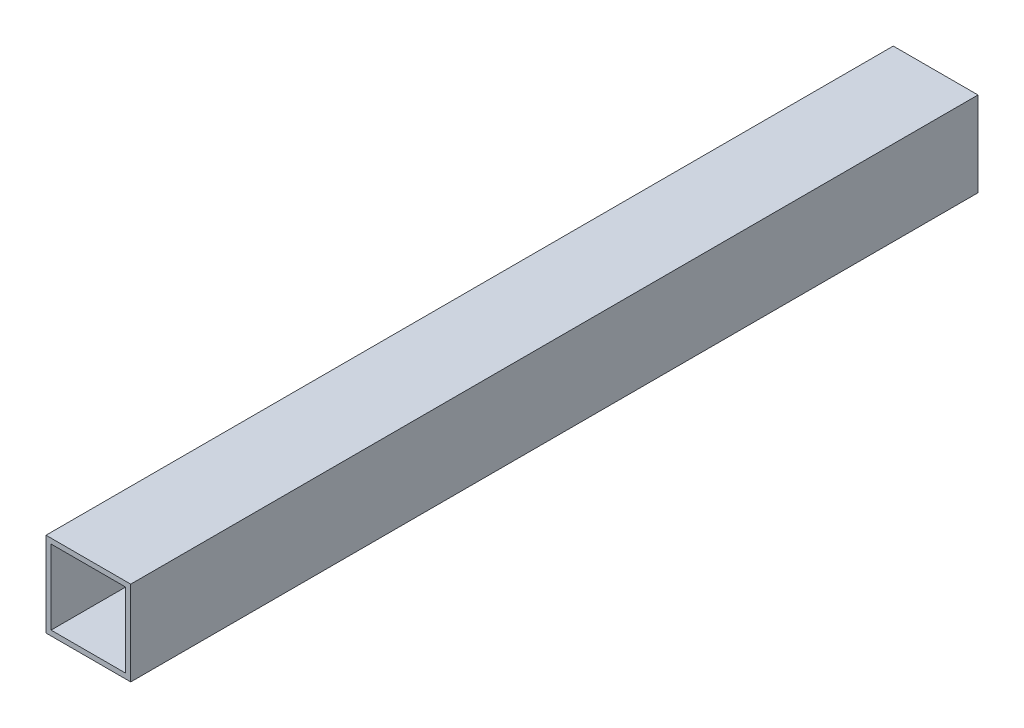
ISO-10303-21;
HEADER;
FILE_DESCRIPTION(('STEP AP214'),'2;1');
FILE_NAME('part.step','',(''),(''),'','','');
FILE_SCHEMA(('AUTOMOTIVE_DESIGN { 1 0 10303 214 1 1 1 1 }'));
ENDSEC;
DATA;
#1=APPLICATION_CONTEXT('core data for automotive mechanical design processes');
#2=APPLICATION_PROTOCOL_DEFINITION('international standard','automotive_design',2000,#1);
#3=PRODUCT_CONTEXT('',#1,'mechanical');
#4=PRODUCT('Part','Part','',(#3));
#5=PRODUCT_RELATED_PRODUCT_CATEGORY('part','',(#4));
#6=PRODUCT_DEFINITION_FORMATION('','',#4);
#7=PRODUCT_DEFINITION_CONTEXT('part definition',#1,'design');
#8=PRODUCT_DEFINITION('design','',#6,#7);
#9=PRODUCT_DEFINITION_SHAPE('','',#8);
#10=(LENGTH_UNIT() NAMED_UNIT(*) SI_UNIT(.MILLI.,.METRE.));
#11=(NAMED_UNIT(*) PLANE_ANGLE_UNIT() SI_UNIT($,.RADIAN.));
#12=(NAMED_UNIT(*) SI_UNIT($,.STERADIAN.) SOLID_ANGLE_UNIT());
#13=UNCERTAINTY_MEASURE_WITH_UNIT(LENGTH_MEASURE(1.E-05),#10,'distance_accuracy_value','');
#14=(GEOMETRIC_REPRESENTATION_CONTEXT(3) GLOBAL_UNCERTAINTY_ASSIGNED_CONTEXT((#13)) GLOBAL_UNIT_ASSIGNED_CONTEXT((#10,
#11,#12)) REPRESENTATION_CONTEXT('',''));
#15=CARTESIAN_POINT('',(0.,0.,0.));
#16=DIRECTION('',(0.,0.,1.));
#17=DIRECTION('',(1.,0.,0.));
#18=AXIS2_PLACEMENT_3D('',#15,#16,#17);
#19=CARTESIAN_POINT('',(0.,0.,250.));
#20=DIRECTION('',(0.,0.,1.));
#21=DIRECTION('',(1.,0.,0.));
#22=AXIS2_PLACEMENT_3D('',#19,#20,#21);
#23=PLANE('',#22);
#24=DIRECTION('',(0.,1.,0.));
#25=VECTOR('',#24,1.);
#26=CARTESIAN_POINT('',(12.5,-12.5,250.));
#27=LINE('',#26,#25);
#28=CARTESIAN_POINT('',(12.5,-12.5,250.));
#29=VERTEX_POINT('',#28);
#30=CARTESIAN_POINT('',(12.5,12.5,250.));
#31=VERTEX_POINT('',#30);
#32=EDGE_CURVE('E157',#29,#31,#27,.T.);
#33=ORIENTED_EDGE('',*,*,#32,.T.);
#34=DIRECTION('',(-1.,0.,0.));
#35=VECTOR('',#34,1.);
#36=CARTESIAN_POINT('',(-12.5,12.5,250.));
#37=LINE('',#36,#35);
#38=CARTESIAN_POINT('',(-12.5,12.5,250.));
#39=VERTEX_POINT('',#38);
#40=EDGE_CURVE('E160',#31,#39,#37,.T.);
#41=ORIENTED_EDGE('',*,*,#40,.T.);
#42=DIRECTION('',(0.,-1.,0.));
#43=VECTOR('',#42,1.);
#44=CARTESIAN_POINT('',(-12.5,-12.5,250.));
#45=LINE('',#44,#43);
#46=CARTESIAN_POINT('',(-12.5,-12.5,250.));
#47=VERTEX_POINT('',#46);
#48=EDGE_CURVE('E163',#39,#47,#45,.T.);
#49=ORIENTED_EDGE('',*,*,#48,.T.);
#50=DIRECTION('',(1.,0.,0.));
#51=VECTOR('',#50,1.);
#52=CARTESIAN_POINT('',(-12.5,-12.5,250.));
#53=LINE('',#52,#51);
#54=EDGE_CURVE('E165',#47,#29,#53,.T.);
#55=ORIENTED_EDGE('',*,*,#54,.T.);
#56=EDGE_LOOP('',(#33,#41,#49,#55));
#57=FACE_BOUND('',#56,.T.);
#58=DIRECTION('',(-1.,0.,0.));
#59=VECTOR('',#58,1.);
#60=CARTESIAN_POINT('',(0.,11.,250.));
#61=LINE('',#60,#59);
#62=CARTESIAN_POINT('',(11.,11.,250.));
#63=VERTEX_POINT('',#62);
#64=CARTESIAN_POINT('',(-11.,11.,250.));
#65=VERTEX_POINT('',#64);
#66=EDGE_CURVE('E129',#63,#65,#61,.T.);
#67=ORIENTED_EDGE('',*,*,#66,.F.);
#68=DIRECTION('',(0.,1.,0.));
#69=VECTOR('',#68,1.);
#70=CARTESIAN_POINT('',(11.,0.,250.));
#71=LINE('',#70,#69);
#72=CARTESIAN_POINT('',(11.,-11.,250.));
#73=VERTEX_POINT('',#72);
#74=EDGE_CURVE('E121',#73,#63,#71,.T.);
#75=ORIENTED_EDGE('',*,*,#74,.F.);
#76=DIRECTION('',(1.,0.,0.));
#77=VECTOR('',#76,1.);
#78=CARTESIAN_POINT('',(0.,-11.,250.));
#79=LINE('',#78,#77);
#80=CARTESIAN_POINT('',(-11.,-11.,250.));
#81=VERTEX_POINT('',#80);
#82=EDGE_CURVE('E143',#81,#73,#79,.T.);
#83=ORIENTED_EDGE('',*,*,#82,.F.);
#84=DIRECTION('',(0.,-1.,0.));
#85=VECTOR('',#84,1.);
#86=CARTESIAN_POINT('',(-11.,0.,250.));
#87=LINE('',#86,#85);
#88=EDGE_CURVE('E141',#65,#81,#87,.T.);
#89=ORIENTED_EDGE('',*,*,#88,.F.);
#90=EDGE_LOOP('',(#67,#75,#83,#89));
#91=FACE_BOUND('',#90,.T.);
#92=ADVANCED_FACE('F56',(#57,#91),#23,.T.);
#93=CARTESIAN_POINT('',(0.,0.,0.));
#94=DIRECTION('',(0.,0.,1.));
#95=DIRECTION('',(1.,0.,0.));
#96=AXIS2_PLACEMENT_3D('',#93,#94,#95);
#97=PLANE('',#96);
#98=DIRECTION('',(0.,1.,0.));
#99=VECTOR('',#98,1.);
#100=CARTESIAN_POINT('',(12.5,-12.5,0.));
#101=LINE('',#100,#99);
#102=CARTESIAN_POINT('',(12.5,-12.5,0.));
#103=VERTEX_POINT('',#102);
#104=CARTESIAN_POINT('',(12.5,12.5,0.));
#105=VERTEX_POINT('',#104);
#106=EDGE_CURVE('E137',#103,#105,#101,.T.);
#107=ORIENTED_EDGE('',*,*,#106,.F.);
#108=DIRECTION('',(1.,0.,0.));
#109=VECTOR('',#108,1.);
#110=CARTESIAN_POINT('',(-12.5,-12.5,0.));
#111=LINE('',#110,#109);
#112=CARTESIAN_POINT('',(-12.5,-12.5,0.));
#113=VERTEX_POINT('',#112);
#114=EDGE_CURVE('E161',#113,#103,#111,.T.);
#115=ORIENTED_EDGE('',*,*,#114,.F.);
#116=DIRECTION('',(0.,-1.,0.));
#117=VECTOR('',#116,1.);
#118=CARTESIAN_POINT('',(-12.5,-12.5,0.));
#119=LINE('',#118,#117);
#120=CARTESIAN_POINT('',(-12.5,12.5,0.));
#121=VERTEX_POINT('',#120);
#122=EDGE_CURVE('E172',#121,#113,#119,.T.);
#123=ORIENTED_EDGE('',*,*,#122,.F.);
#124=DIRECTION('',(-1.,0.,0.));
#125=VECTOR('',#124,1.);
#126=CARTESIAN_POINT('',(-12.5,12.5,0.));
#127=LINE('',#126,#125);
#128=EDGE_CURVE('E170',#105,#121,#127,.T.);
#129=ORIENTED_EDGE('',*,*,#128,.F.);
#130=EDGE_LOOP('',(#107,#115,#123,#129));
#131=FACE_BOUND('',#130,.T.);
#132=DIRECTION('',(0.,1.,0.));
#133=VECTOR('',#132,1.);
#134=CARTESIAN_POINT('',(11.,0.,0.));
#135=LINE('',#134,#133);
#136=CARTESIAN_POINT('',(11.,-11.,0.));
#137=VERTEX_POINT('',#136);
#138=CARTESIAN_POINT('',(11.,11.,0.));
#139=VERTEX_POINT('',#138);
#140=EDGE_CURVE('E79',#137,#139,#135,.T.);
#141=ORIENTED_EDGE('',*,*,#140,.T.);
#142=DIRECTION('',(-1.,0.,0.));
#143=VECTOR('',#142,1.);
#144=CARTESIAN_POINT('',(0.,11.,0.));
#145=LINE('',#144,#143);
#146=CARTESIAN_POINT('',(-11.,11.,0.));
#147=VERTEX_POINT('',#146);
#148=EDGE_CURVE('E136',#139,#147,#145,.T.);
#149=ORIENTED_EDGE('',*,*,#148,.T.);
#150=DIRECTION('',(0.,-1.,0.));
#151=VECTOR('',#150,1.);
#152=CARTESIAN_POINT('',(-11.,0.,0.));
#153=LINE('',#152,#151);
#154=CARTESIAN_POINT('',(-11.,-11.,0.));
#155=VERTEX_POINT('',#154);
#156=EDGE_CURVE('E149',#147,#155,#153,.T.);
#157=ORIENTED_EDGE('',*,*,#156,.T.);
#158=DIRECTION('',(1.,0.,0.));
#159=VECTOR('',#158,1.);
#160=CARTESIAN_POINT('',(0.,-11.,0.));
#161=LINE('',#160,#159);
#162=EDGE_CURVE('E130',#155,#137,#161,.T.);
#163=ORIENTED_EDGE('',*,*,#162,.T.);
#164=EDGE_LOOP('',(#141,#149,#157,#163));
#165=FACE_BOUND('',#164,.T.);
#166=ADVANCED_FACE('F190',(#131,#165),#97,.F.);
#167=CARTESIAN_POINT('',(12.5,-12.5,250.));
#168=DIRECTION('',(-1.,0.,0.));
#169=DIRECTION('',(0.,0.,1.));
#170=AXIS2_PLACEMENT_3D('',#167,#168,#169);
#171=PLANE('',#170);
#172=ORIENTED_EDGE('',*,*,#106,.T.);
#173=DIRECTION('',(0.,0.,-1.));
#174=VECTOR('',#173,1.);
#175=CARTESIAN_POINT('',(12.5,12.5,250.));
#176=LINE('',#175,#174);
#177=EDGE_CURVE('E12',#31,#105,#176,.T.);
#178=ORIENTED_EDGE('',*,*,#177,.F.);
#179=ORIENTED_EDGE('',*,*,#32,.F.);
#180=DIRECTION('',(0.,0.,-1.));
#181=VECTOR('',#180,1.);
#182=CARTESIAN_POINT('',(12.5,-12.5,250.));
#183=LINE('',#182,#181);
#184=EDGE_CURVE('E167',#29,#103,#183,.T.);
#185=ORIENTED_EDGE('',*,*,#184,.T.);
#186=EDGE_LOOP('',(#172,#178,#179,#185));
#187=FACE_BOUND('',#186,.T.);
#188=ADVANCED_FACE('F58',(#187),#171,.F.);
#189=CARTESIAN_POINT('',(-12.5,12.5,250.));
#190=DIRECTION('',(0.,-1.,0.));
#191=DIRECTION('',(0.,0.,-1.));
#192=AXIS2_PLACEMENT_3D('',#189,#190,#191);
#193=PLANE('',#192);
#194=ORIENTED_EDGE('',*,*,#128,.T.);
#195=DIRECTION('',(0.,0.,-1.));
#196=VECTOR('',#195,1.);
#197=CARTESIAN_POINT('',(-12.5,12.5,250.));
#198=LINE('',#197,#196);
#199=EDGE_CURVE('E64',#39,#121,#198,.T.);
#200=ORIENTED_EDGE('',*,*,#199,.F.);
#201=ORIENTED_EDGE('',*,*,#40,.F.);
#202=ORIENTED_EDGE('',*,*,#177,.T.);
#203=EDGE_LOOP('',(#194,#200,#201,#202));
#204=FACE_BOUND('',#203,.T.);
#205=ADVANCED_FACE('F200',(#204),#193,.F.);
#206=CARTESIAN_POINT('',(-12.5,-12.5,250.));
#207=DIRECTION('',(1.,0.,0.));
#208=DIRECTION('',(0.,0.,-1.));
#209=AXIS2_PLACEMENT_3D('',#206,#207,#208);
#210=PLANE('',#209);
#211=ORIENTED_EDGE('',*,*,#122,.T.);
#212=DIRECTION('',(0.,0.,-1.));
#213=VECTOR('',#212,1.);
#214=CARTESIAN_POINT('',(-12.5,-12.5,250.));
#215=LINE('',#214,#213);
#216=EDGE_CURVE('E177',#47,#113,#215,.T.);
#217=ORIENTED_EDGE('',*,*,#216,.F.);
#218=ORIENTED_EDGE('',*,*,#48,.F.);
#219=ORIENTED_EDGE('',*,*,#199,.T.);
#220=EDGE_LOOP('',(#211,#217,#218,#219));
#221=FACE_BOUND('',#220,.T.);
#222=ADVANCED_FACE('F184',(#221),#210,.F.);
#223=CARTESIAN_POINT('',(-12.5,-12.5,250.));
#224=DIRECTION('',(0.,1.,0.));
#225=DIRECTION('',(0.,0.,1.));
#226=AXIS2_PLACEMENT_3D('',#223,#224,#225);
#227=PLANE('',#226);
#228=ORIENTED_EDGE('',*,*,#114,.T.);
#229=ORIENTED_EDGE('',*,*,#184,.F.);
#230=ORIENTED_EDGE('',*,*,#54,.F.);
#231=ORIENTED_EDGE('',*,*,#216,.T.);
#232=EDGE_LOOP('',(#228,#229,#230,#231));
#233=FACE_BOUND('',#232,.T.);
#234=ADVANCED_FACE('F194',(#233),#227,.F.);
#235=CARTESIAN_POINT('',(11.,0.,250.));
#236=DIRECTION('',(-1.,0.,0.));
#237=DIRECTION('',(0.,0.,1.));
#238=AXIS2_PLACEMENT_3D('',#235,#236,#237);
#239=PLANE('',#238);
#240=ORIENTED_EDGE('',*,*,#140,.F.);
#241=DIRECTION('',(0.,0.,-1.));
#242=VECTOR('',#241,1.);
#243=CARTESIAN_POINT('',(11.,-11.,250.));
#244=LINE('',#243,#242);
#245=EDGE_CURVE('E125',#73,#137,#244,.T.);
#246=ORIENTED_EDGE('',*,*,#245,.F.);
#247=ORIENTED_EDGE('',*,*,#74,.T.);
#248=DIRECTION('',(0.,0.,-1.));
#249=VECTOR('',#248,1.);
#250=CARTESIAN_POINT('',(11.,11.,250.));
#251=LINE('',#250,#249);
#252=EDGE_CURVE('E124',#63,#139,#251,.T.);
#253=ORIENTED_EDGE('',*,*,#252,.T.);
#254=EDGE_LOOP('',(#240,#246,#247,#253));
#255=FACE_BOUND('',#254,.T.);
#256=ADVANCED_FACE('F123',(#255),#239,.T.);
#257=CARTESIAN_POINT('',(0.,11.,250.));
#258=DIRECTION('',(0.,-1.,0.));
#259=DIRECTION('',(0.,0.,-1.));
#260=AXIS2_PLACEMENT_3D('',#257,#258,#259);
#261=PLANE('',#260);
#262=ORIENTED_EDGE('',*,*,#148,.F.);
#263=ORIENTED_EDGE('',*,*,#252,.F.);
#264=ORIENTED_EDGE('',*,*,#66,.T.);
#265=DIRECTION('',(0.,0.,-1.));
#266=VECTOR('',#265,1.);
#267=CARTESIAN_POINT('',(-11.,11.,250.));
#268=LINE('',#267,#266);
#269=EDGE_CURVE('E138',#65,#147,#268,.T.);
#270=ORIENTED_EDGE('',*,*,#269,.T.);
#271=EDGE_LOOP('',(#262,#263,#264,#270));
#272=FACE_BOUND('',#271,.T.);
#273=ADVANCED_FACE('F133',(#272),#261,.T.);
#274=CARTESIAN_POINT('',(-11.,0.,250.));
#275=DIRECTION('',(1.,0.,0.));
#276=DIRECTION('',(0.,0.,-1.));
#277=AXIS2_PLACEMENT_3D('',#274,#275,#276);
#278=PLANE('',#277);
#279=ORIENTED_EDGE('',*,*,#156,.F.);
#280=ORIENTED_EDGE('',*,*,#269,.F.);
#281=ORIENTED_EDGE('',*,*,#88,.T.);
#282=DIRECTION('',(0.,0.,-1.));
#283=VECTOR('',#282,1.);
#284=CARTESIAN_POINT('',(-11.,-11.,250.));
#285=LINE('',#284,#283);
#286=EDGE_CURVE('E71',#81,#155,#285,.T.);
#287=ORIENTED_EDGE('',*,*,#286,.T.);
#288=EDGE_LOOP('',(#279,#280,#281,#287));
#289=FACE_BOUND('',#288,.T.);
#290=ADVANCED_FACE('F223',(#289),#278,.T.);
#291=CARTESIAN_POINT('',(0.,-11.,250.));
#292=DIRECTION('',(0.,1.,0.));
#293=DIRECTION('',(0.,0.,1.));
#294=AXIS2_PLACEMENT_3D('',#291,#292,#293);
#295=PLANE('',#294);
#296=ORIENTED_EDGE('',*,*,#162,.F.);
#297=ORIENTED_EDGE('',*,*,#286,.F.);
#298=ORIENTED_EDGE('',*,*,#82,.T.);
#299=ORIENTED_EDGE('',*,*,#245,.T.);
#300=EDGE_LOOP('',(#296,#297,#298,#299));
#301=FACE_BOUND('',#300,.T.);
#302=ADVANCED_FACE('F227',(#301),#295,.T.);
#303=CLOSED_SHELL('',(#92,#166,#188,#205,#222,#234,#256,#273,#290,#302));
#304=MANIFOLD_SOLID_BREP('B2',#303);
#305=ADVANCED_BREP_SHAPE_REPRESENTATION('',(#18,#304),#14);
#306=SHAPE_DEFINITION_REPRESENTATION(#9,#305);
ENDSEC;
END-ISO-10303-21;
